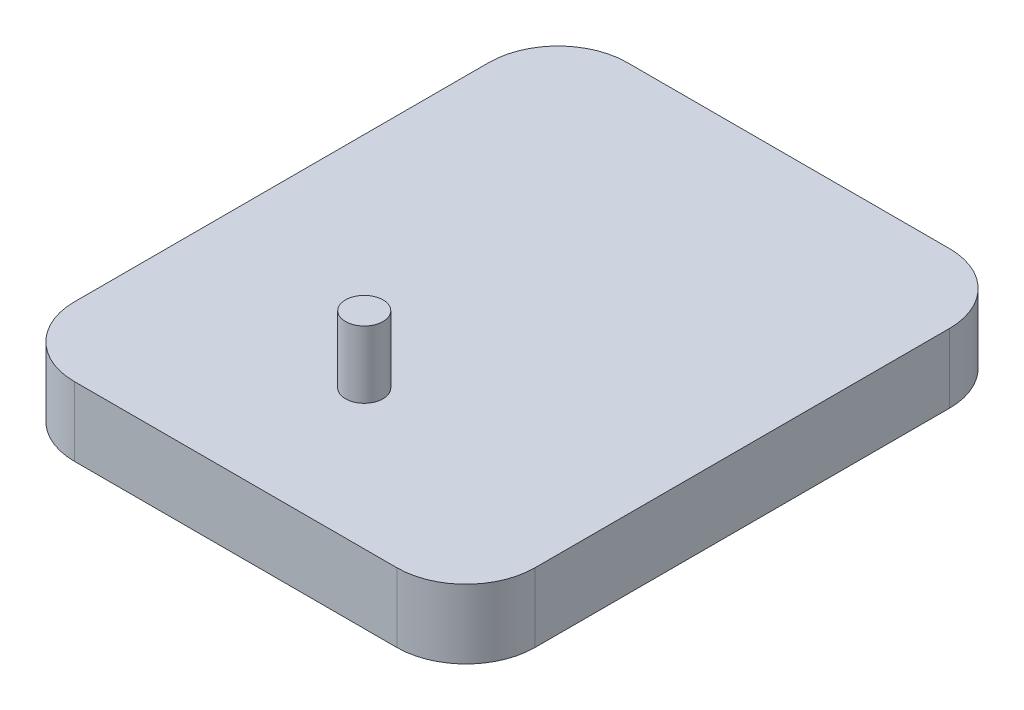
ISO-10303-21;
HEADER;
FILE_DESCRIPTION(('STEP AP214'),'2;1');
FILE_NAME('part.step','',(''),(''),'','','');
FILE_SCHEMA(('AUTOMOTIVE_DESIGN { 1 0 10303 214 1 1 1 1 }'));
ENDSEC;
DATA;
#1=APPLICATION_CONTEXT('core data for automotive mechanical design processes');
#2=APPLICATION_PROTOCOL_DEFINITION('international standard','automotive_design',2000,#1);
#3=PRODUCT_CONTEXT('',#1,'mechanical');
#4=PRODUCT('Part','Part','',(#3));
#5=PRODUCT_RELATED_PRODUCT_CATEGORY('part','',(#4));
#6=PRODUCT_DEFINITION_FORMATION('','',#4);
#7=PRODUCT_DEFINITION_CONTEXT('part definition',#1,'design');
#8=PRODUCT_DEFINITION('design','',#6,#7);
#9=PRODUCT_DEFINITION_SHAPE('','',#8);
#10=(LENGTH_UNIT() NAMED_UNIT(*) SI_UNIT(.MILLI.,.METRE.));
#11=(NAMED_UNIT(*) PLANE_ANGLE_UNIT() SI_UNIT($,.RADIAN.));
#12=(NAMED_UNIT(*) SI_UNIT($,.STERADIAN.) SOLID_ANGLE_UNIT());
#13=UNCERTAINTY_MEASURE_WITH_UNIT(LENGTH_MEASURE(1.E-05),#10,'distance_accuracy_value','');
#14=(GEOMETRIC_REPRESENTATION_CONTEXT(3) GLOBAL_UNCERTAINTY_ASSIGNED_CONTEXT((#13)) GLOBAL_UNIT_ASSIGNED_CONTEXT((#10,
#11,#12)) REPRESENTATION_CONTEXT('',''));
#15=CARTESIAN_POINT('',(0.,0.,0.));
#16=DIRECTION('',(0.,0.,1.));
#17=DIRECTION('',(1.,0.,0.));
#18=AXIS2_PLACEMENT_3D('',#15,#16,#17);
#19=CARTESIAN_POINT('',(0.,80.9453000938894,81.4767223054108));
#20=DIRECTION('',(0.,1.,0.));
#21=DIRECTION('',(0.,0.,1.));
#22=AXIS2_PLACEMENT_3D('',#19,#20,#21);
#23=CYLINDRICAL_SURFACE('',#22,10.3533956520688);
#24=CARTESIAN_POINT('',(0.,44.033193856079,81.4767223054108));
#25=DIRECTION('',(0.,1.,0.));
#26=DIRECTION('',(0.,0.,1.));
#27=AXIS2_PLACEMENT_3D('',#24,#25,#26);
#28=CIRCLE('',#27,10.3533956520688);
#29=CARTESIAN_POINT('',(0.,44.033193856079,91.8301179574795));
#30=VERTEX_POINT('',#29);
#31=EDGE_CURVE('E11',#30,#30,#28,.T.);
#32=ORIENTED_EDGE('',*,*,#31,.T.);
#33=EDGE_LOOP('',(#32));
#34=FACE_BOUND('',#33,.T.);
#35=CARTESIAN_POINT('',(0.,80.9453000938894,81.4767223054108));
#36=DIRECTION('',(0.,1.,0.));
#37=DIRECTION('',(0.,0.,1.));
#38=AXIS2_PLACEMENT_3D('',#35,#36,#37);
#39=CIRCLE('',#38,10.3533956520688);
#40=CARTESIAN_POINT('',(0.,80.9453000938894,91.8301179574795));
#41=VERTEX_POINT('',#40);
#42=EDGE_CURVE('E51',#41,#41,#39,.T.);
#43=ORIENTED_EDGE('',*,*,#42,.F.);
#44=EDGE_LOOP('',(#43));
#45=FACE_BOUND('',#44,.T.);
#46=ADVANCED_FACE('F45',(#34,#45),#23,.T.);
#47=CARTESIAN_POINT('',(0.,44.033193856079,91.8301179574795));
#48=DIRECTION('',(0.,-1.,0.));
#49=DIRECTION('',(0.,0.,-1.));
#50=AXIS2_PLACEMENT_3D('',#47,#48,#49);
#51=PLANE('',#50);
#52=ORIENTED_EDGE('',*,*,#31,.F.);
#53=EDGE_LOOP('',(#52));
#54=FACE_BOUND('',#53,.T.);
#55=ADVANCED_FACE('F60',(#54),#51,.T.);
#56=CARTESIAN_POINT('',(0.,80.9453000938894,91.8301179574795));
#57=DIRECTION('',(0.,1.,0.));
#58=DIRECTION('',(0.,0.,1.));
#59=AXIS2_PLACEMENT_3D('',#56,#57,#58);
#60=PLANE('',#59);
#61=ORIENTED_EDGE('',*,*,#42,.T.);
#62=EDGE_LOOP('',(#61));
#63=FACE_BOUND('',#62,.T.);
#64=ADVANCED_FACE('F57',(#63),#60,.T.);
#65=CLOSED_SHELL('',(#46,#55,#64));
#66=MANIFOLD_SOLID_BREP('B2',#65);
#67=CARTESIAN_POINT('',(-127.,38.1,-152.4));
#68=DIRECTION('',(1.,0.,0.));
#69=DIRECTION('',(0.,0.,-1.));
#70=AXIS2_PLACEMENT_3D('',#67,#68,#69);
#71=PLANE('',#70);
#72=DIRECTION('',(0.,0.,1.));
#73=VECTOR('',#72,1.);
#74=CARTESIAN_POINT('',(-127.,38.1,-152.4));
#75=LINE('',#74,#73);
#76=CARTESIAN_POINT('',(-127.,38.1,-114.3));
#77=VERTEX_POINT('',#76);
#78=CARTESIAN_POINT('',(-127.,38.1,114.3));
#79=VERTEX_POINT('',#78);
#80=EDGE_CURVE('E170',#77,#79,#75,.T.);
#81=ORIENTED_EDGE('',*,*,#80,.F.);
#82=DIRECTION('',(0.,-1.,0.));
#83=VECTOR('',#82,1.);
#84=CARTESIAN_POINT('',(-127.,38.1,-114.3));
#85=LINE('',#84,#83);
#86=CARTESIAN_POINT('',(-127.,0.,-114.3));
#87=VERTEX_POINT('',#86);
#88=EDGE_CURVE('E155',#77,#87,#85,.T.);
#89=ORIENTED_EDGE('',*,*,#88,.T.);
#90=DIRECTION('',(0.,0.,1.));
#91=VECTOR('',#90,1.);
#92=CARTESIAN_POINT('',(-127.,0.,-152.4));
#93=LINE('',#92,#91);
#94=CARTESIAN_POINT('',(-127.,0.,114.3));
#95=VERTEX_POINT('',#94);
#96=EDGE_CURVE('E167',#87,#95,#93,.T.);
#97=ORIENTED_EDGE('',*,*,#96,.T.);
#98=DIRECTION('',(0.,-1.,0.));
#99=VECTOR('',#98,1.);
#100=CARTESIAN_POINT('',(-127.,38.1,114.3));
#101=LINE('',#100,#99);
#102=EDGE_CURVE('E172',#95,#79,#101,.F.);
#103=ORIENTED_EDGE('',*,*,#102,.T.);
#104=EDGE_LOOP('',(#81,#89,#97,#103));
#105=FACE_BOUND('',#104,.T.);
#106=ADVANCED_FACE('F85',(#105),#71,.F.);
#107=CARTESIAN_POINT('',(-127.,38.1,152.4));
#108=DIRECTION('',(0.,0.,-1.));
#109=DIRECTION('',(-1.,0.,0.));
#110=AXIS2_PLACEMENT_3D('',#107,#108,#109);
#111=PLANE('',#110);
#112=DIRECTION('',(1.,0.,0.));
#113=VECTOR('',#112,1.);
#114=CARTESIAN_POINT('',(-127.,0.,152.4));
#115=LINE('',#114,#113);
#116=CARTESIAN_POINT('',(-88.9,0.,152.4));
#117=VERTEX_POINT('',#116);
#118=CARTESIAN_POINT('',(88.9,0.,152.4));
#119=VERTEX_POINT('',#118);
#120=EDGE_CURVE('E176',#117,#119,#115,.T.);
#121=ORIENTED_EDGE('',*,*,#120,.T.);
#122=DIRECTION('',(0.,-1.,0.));
#123=VECTOR('',#122,1.);
#124=CARTESIAN_POINT('',(88.9,38.1,152.4));
#125=LINE('',#124,#123);
#126=CARTESIAN_POINT('',(88.9,38.1,152.4));
#127=VERTEX_POINT('',#126);
#128=EDGE_CURVE('E43',#119,#127,#125,.F.);
#129=ORIENTED_EDGE('',*,*,#128,.T.);
#130=DIRECTION('',(1.,0.,0.));
#131=VECTOR('',#130,1.);
#132=CARTESIAN_POINT('',(-127.,38.1,152.4));
#133=LINE('',#132,#131);
#134=CARTESIAN_POINT('',(-88.9,38.1,152.4));
#135=VERTEX_POINT('',#134);
#136=EDGE_CURVE('E212',#135,#127,#133,.T.);
#137=ORIENTED_EDGE('',*,*,#136,.F.);
#138=DIRECTION('',(0.,-1.,0.));
#139=VECTOR('',#138,1.);
#140=CARTESIAN_POINT('',(-88.9,38.1,152.4));
#141=LINE('',#140,#139);
#142=EDGE_CURVE('E93',#135,#117,#141,.T.);
#143=ORIENTED_EDGE('',*,*,#142,.T.);
#144=EDGE_LOOP('',(#121,#129,#137,#143));
#145=FACE_BOUND('',#144,.T.);
#146=ADVANCED_FACE('F210',(#145),#111,.F.);
#147=CARTESIAN_POINT('',(127.,38.1,-152.4));
#148=DIRECTION('',(-1.,0.,0.));
#149=DIRECTION('',(0.,0.,1.));
#150=AXIS2_PLACEMENT_3D('',#147,#148,#149);
#151=PLANE('',#150);
#152=DIRECTION('',(0.,0.,-1.));
#153=VECTOR('',#152,1.);
#154=CARTESIAN_POINT('',(127.,0.,-152.4));
#155=LINE('',#154,#153);
#156=CARTESIAN_POINT('',(127.,0.,114.3));
#157=VERTEX_POINT('',#156);
#158=CARTESIAN_POINT('',(127.,0.,-114.3));
#159=VERTEX_POINT('',#158);
#160=EDGE_CURVE('E179',#157,#159,#155,.T.);
#161=ORIENTED_EDGE('',*,*,#160,.T.);
#162=DIRECTION('',(0.,-1.,0.));
#163=VECTOR('',#162,1.);
#164=CARTESIAN_POINT('',(127.,38.1,-114.3));
#165=LINE('',#164,#163);
#166=CARTESIAN_POINT('',(127.,38.1,-114.3));
#167=VERTEX_POINT('',#166);
#168=EDGE_CURVE('E100',#159,#167,#165,.F.);
#169=ORIENTED_EDGE('',*,*,#168,.T.);
#170=DIRECTION('',(0.,0.,-1.));
#171=VECTOR('',#170,1.);
#172=CARTESIAN_POINT('',(127.,38.1,-152.4));
#173=LINE('',#172,#171);
#174=CARTESIAN_POINT('',(127.,38.1,114.3));
#175=VERTEX_POINT('',#174);
#176=EDGE_CURVE('E220',#175,#167,#173,.T.);
#177=ORIENTED_EDGE('',*,*,#176,.F.);
#178=DIRECTION('',(0.,-1.,0.));
#179=VECTOR('',#178,1.);
#180=CARTESIAN_POINT('',(127.,38.1,114.3));
#181=LINE('',#180,#179);
#182=EDGE_CURVE('E203',#175,#157,#181,.T.);
#183=ORIENTED_EDGE('',*,*,#182,.T.);
#184=EDGE_LOOP('',(#161,#169,#177,#183));
#185=FACE_BOUND('',#184,.T.);
#186=ADVANCED_FACE('F219',(#185),#151,.F.);
#187=CARTESIAN_POINT('',(-127.,38.1,-152.4));
#188=DIRECTION('',(0.,0.,1.));
#189=DIRECTION('',(1.,0.,0.));
#190=AXIS2_PLACEMENT_3D('',#187,#188,#189);
#191=PLANE('',#190);
#192=DIRECTION('',(-1.,0.,0.));
#193=VECTOR('',#192,1.);
#194=CARTESIAN_POINT('',(-127.,0.,-152.4));
#195=LINE('',#194,#193);
#196=CARTESIAN_POINT('',(88.9,0.,-152.4));
#197=VERTEX_POINT('',#196);
#198=CARTESIAN_POINT('',(-88.9,0.,-152.4));
#199=VERTEX_POINT('',#198);
#200=EDGE_CURVE('E186',#197,#199,#195,.T.);
#201=ORIENTED_EDGE('',*,*,#200,.T.);
#202=DIRECTION('',(0.,-1.,0.));
#203=VECTOR('',#202,1.);
#204=CARTESIAN_POINT('',(-88.9,38.1,-152.4));
#205=LINE('',#204,#203);
#206=CARTESIAN_POINT('',(-88.9,38.1,-152.4));
#207=VERTEX_POINT('',#206);
#208=EDGE_CURVE('E156',#199,#207,#205,.F.);
#209=ORIENTED_EDGE('',*,*,#208,.T.);
#210=DIRECTION('',(-1.,0.,0.));
#211=VECTOR('',#210,1.);
#212=CARTESIAN_POINT('',(-127.,38.1,-152.4));
#213=LINE('',#212,#211);
#214=CARTESIAN_POINT('',(88.9,38.1,-152.4));
#215=VERTEX_POINT('',#214);
#216=EDGE_CURVE('E182',#215,#207,#213,.T.);
#217=ORIENTED_EDGE('',*,*,#216,.F.);
#218=DIRECTION('',(0.,-1.,0.));
#219=VECTOR('',#218,1.);
#220=CARTESIAN_POINT('',(88.9,38.1,-152.4));
#221=LINE('',#220,#219);
#222=EDGE_CURVE('E161',#215,#197,#221,.T.);
#223=ORIENTED_EDGE('',*,*,#222,.T.);
#224=EDGE_LOOP('',(#201,#209,#217,#223));
#225=FACE_BOUND('',#224,.T.);
#226=ADVANCED_FACE('F248',(#225),#191,.F.);
#227=CARTESIAN_POINT('',(0.,38.1,0.));
#228=DIRECTION('',(0.,1.,0.));
#229=DIRECTION('',(0.,0.,1.));
#230=AXIS2_PLACEMENT_3D('',#227,#228,#229);
#231=PLANE('',#230);
#232=ORIENTED_EDGE('',*,*,#216,.T.);
#233=CARTESIAN_POINT('',(-88.9,38.1,-114.3));
#234=DIRECTION('',(0.,1.,0.));
#235=DIRECTION('',(0.,0.,1.));
#236=AXIS2_PLACEMENT_3D('',#233,#234,#235);
#237=CIRCLE('',#236,38.1);
#238=EDGE_CURVE('E201',#207,#77,#237,.T.);
#239=ORIENTED_EDGE('',*,*,#238,.T.);
#240=ORIENTED_EDGE('',*,*,#80,.T.);
#241=CARTESIAN_POINT('',(-88.9,38.1,114.3));
#242=DIRECTION('',(0.,1.,0.));
#243=DIRECTION('',(0.,0.,1.));
#244=AXIS2_PLACEMENT_3D('',#241,#242,#243);
#245=CIRCLE('',#244,38.1);
#246=EDGE_CURVE('E196',#79,#135,#245,.T.);
#247=ORIENTED_EDGE('',*,*,#246,.T.);
#248=ORIENTED_EDGE('',*,*,#136,.T.);
#249=CARTESIAN_POINT('',(88.9,38.1,114.3));
#250=DIRECTION('',(0.,1.,0.));
#251=DIRECTION('',(0.,0.,1.));
#252=AXIS2_PLACEMENT_3D('',#249,#250,#251);
#253=CIRCLE('',#252,38.1);
#254=EDGE_CURVE('E107',#127,#175,#253,.T.);
#255=ORIENTED_EDGE('',*,*,#254,.T.);
#256=ORIENTED_EDGE('',*,*,#176,.T.);
#257=CARTESIAN_POINT('',(88.9,38.1,-114.3));
#258=DIRECTION('',(0.,1.,0.));
#259=DIRECTION('',(0.,0.,1.));
#260=AXIS2_PLACEMENT_3D('',#257,#258,#259);
#261=CIRCLE('',#260,38.1);
#262=EDGE_CURVE('E199',#167,#215,#261,.T.);
#263=ORIENTED_EDGE('',*,*,#262,.T.);
#264=EDGE_LOOP('',(#232,#239,#240,#247,#248,#255,#256,#263));
#265=FACE_BOUND('',#264,.T.);
#266=ADVANCED_FACE('F225',(#265),#231,.T.);
#267=CARTESIAN_POINT('',(0.,0.,0.));
#268=DIRECTION('',(0.,1.,0.));
#269=DIRECTION('',(0.,0.,1.));
#270=AXIS2_PLACEMENT_3D('',#267,#268,#269);
#271=PLANE('',#270);
#272=ORIENTED_EDGE('',*,*,#96,.F.);
#273=CARTESIAN_POINT('',(-88.9,0.,-114.3));
#274=DIRECTION('',(0.,1.,0.));
#275=DIRECTION('',(0.,0.,1.));
#276=AXIS2_PLACEMENT_3D('',#273,#274,#275);
#277=CIRCLE('',#276,38.1);
#278=EDGE_CURVE('E151',#87,#199,#277,.F.);
#279=ORIENTED_EDGE('',*,*,#278,.T.);
#280=ORIENTED_EDGE('',*,*,#200,.F.);
#281=CARTESIAN_POINT('',(88.9,0.,-114.3));
#282=DIRECTION('',(0.,1.,0.));
#283=DIRECTION('',(0.,0.,1.));
#284=AXIS2_PLACEMENT_3D('',#281,#282,#283);
#285=CIRCLE('',#284,38.1);
#286=EDGE_CURVE('E162',#197,#159,#285,.F.);
#287=ORIENTED_EDGE('',*,*,#286,.T.);
#288=ORIENTED_EDGE('',*,*,#160,.F.);
#289=CARTESIAN_POINT('',(88.9,0.,114.3));
#290=DIRECTION('',(0.,1.,0.));
#291=DIRECTION('',(0.,0.,1.));
#292=AXIS2_PLACEMENT_3D('',#289,#290,#291);
#293=CIRCLE('',#292,38.1);
#294=EDGE_CURVE('E190',#157,#119,#293,.F.);
#295=ORIENTED_EDGE('',*,*,#294,.T.);
#296=ORIENTED_EDGE('',*,*,#120,.F.);
#297=CARTESIAN_POINT('',(-88.9,0.,114.3));
#298=DIRECTION('',(0.,1.,0.));
#299=DIRECTION('',(0.,0.,1.));
#300=AXIS2_PLACEMENT_3D('',#297,#298,#299);
#301=CIRCLE('',#300,38.1);
#302=EDGE_CURVE('E171',#117,#95,#301,.F.);
#303=ORIENTED_EDGE('',*,*,#302,.T.);
#304=EDGE_LOOP('',(#272,#279,#280,#287,#288,#295,#296,#303));
#305=FACE_BOUND('',#304,.T.);
#306=ADVANCED_FACE('F174',(#305),#271,.F.);
#307=CARTESIAN_POINT('',(-88.9,38.1,-114.3));
#308=DIRECTION('',(0.,-1.,0.));
#309=DIRECTION('',(0.,0.,-1.));
#310=AXIS2_PLACEMENT_3D('',#307,#308,#309);
#311=CYLINDRICAL_SURFACE('',#310,38.1);
#312=ORIENTED_EDGE('',*,*,#238,.F.);
#313=ORIENTED_EDGE('',*,*,#208,.F.);
#314=ORIENTED_EDGE('',*,*,#278,.F.);
#315=ORIENTED_EDGE('',*,*,#88,.F.);
#316=EDGE_LOOP('',(#312,#313,#314,#315));
#317=FACE_BOUND('',#316,.T.);
#318=ADVANCED_FACE('F154',(#317),#311,.T.);
#319=CARTESIAN_POINT('',(88.9,38.1,-114.3));
#320=DIRECTION('',(0.,-1.,0.));
#321=DIRECTION('',(0.,0.,-1.));
#322=AXIS2_PLACEMENT_3D('',#319,#320,#321);
#323=CYLINDRICAL_SURFACE('',#322,38.1);
#324=ORIENTED_EDGE('',*,*,#262,.F.);
#325=ORIENTED_EDGE('',*,*,#168,.F.);
#326=ORIENTED_EDGE('',*,*,#286,.F.);
#327=ORIENTED_EDGE('',*,*,#222,.F.);
#328=EDGE_LOOP('',(#324,#325,#326,#327));
#329=FACE_BOUND('',#328,.T.);
#330=ADVANCED_FACE('F230',(#329),#323,.T.);
#331=CARTESIAN_POINT('',(88.9,38.1,114.3));
#332=DIRECTION('',(0.,-1.,0.));
#333=DIRECTION('',(0.,0.,-1.));
#334=AXIS2_PLACEMENT_3D('',#331,#332,#333);
#335=CYLINDRICAL_SURFACE('',#334,38.1);
#336=ORIENTED_EDGE('',*,*,#254,.F.);
#337=ORIENTED_EDGE('',*,*,#128,.F.);
#338=ORIENTED_EDGE('',*,*,#294,.F.);
#339=ORIENTED_EDGE('',*,*,#182,.F.);
#340=EDGE_LOOP('',(#336,#337,#338,#339));
#341=FACE_BOUND('',#340,.T.);
#342=ADVANCED_FACE('F218',(#341),#335,.T.);
#343=CARTESIAN_POINT('',(-88.9,38.1,114.3));
#344=DIRECTION('',(0.,-1.,0.));
#345=DIRECTION('',(0.,0.,-1.));
#346=AXIS2_PLACEMENT_3D('',#343,#344,#345);
#347=CYLINDRICAL_SURFACE('',#346,38.1);
#348=ORIENTED_EDGE('',*,*,#246,.F.);
#349=ORIENTED_EDGE('',*,*,#102,.F.);
#350=ORIENTED_EDGE('',*,*,#302,.F.);
#351=ORIENTED_EDGE('',*,*,#142,.F.);
#352=EDGE_LOOP('',(#348,#349,#350,#351));
#353=FACE_BOUND('',#352,.T.);
#354=ADVANCED_FACE('F87',(#353),#347,.T.);
#355=CLOSED_SHELL('',(#106,#146,#186,#226,#266,#306,#318,#330,#342,#354));
#356=MANIFOLD_SOLID_BREP('B6',#355);
#357=ADVANCED_BREP_SHAPE_REPRESENTATION('',(#18,#66,#356),#14);
#358=SHAPE_DEFINITION_REPRESENTATION(#9,#357);
ENDSEC;
END-ISO-10303-21;
